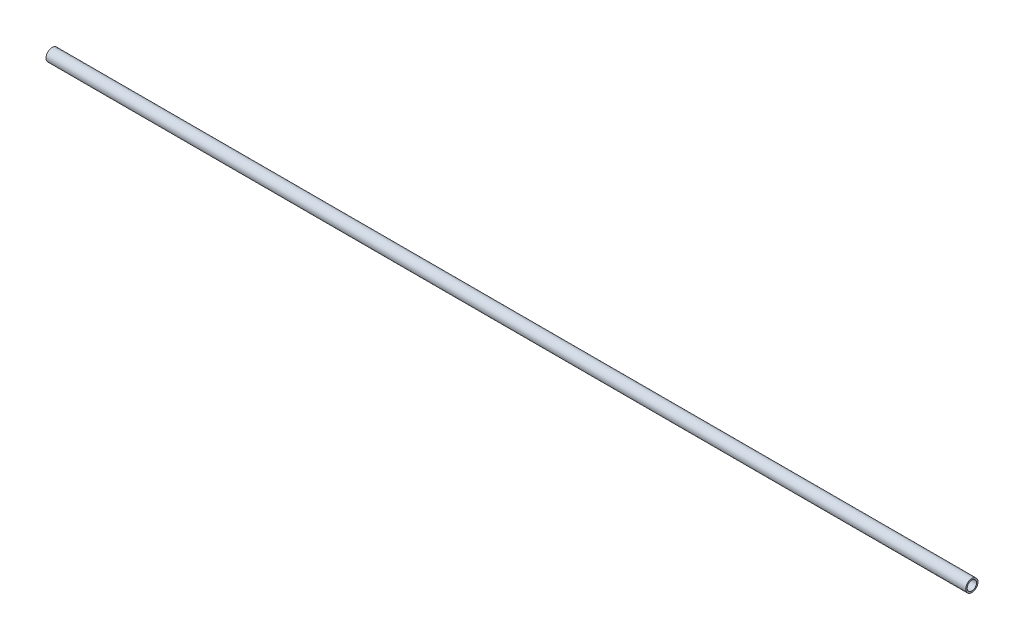
ISO-10303-21;
HEADER;
FILE_DESCRIPTION(('STEP AP214'),'2;1');
FILE_NAME('part.step','',(''),(''),'','','');
FILE_SCHEMA(('AUTOMOTIVE_DESIGN { 1 0 10303 214 1 1 1 1 }'));
ENDSEC;
DATA;
#1=APPLICATION_CONTEXT('core data for automotive mechanical design processes');
#2=APPLICATION_PROTOCOL_DEFINITION('international standard','automotive_design',2000,#1);
#3=PRODUCT_CONTEXT('',#1,'mechanical');
#4=PRODUCT('Part','Part','',(#3));
#5=PRODUCT_RELATED_PRODUCT_CATEGORY('part','',(#4));
#6=PRODUCT_DEFINITION_FORMATION('','',#4);
#7=PRODUCT_DEFINITION_CONTEXT('part definition',#1,'design');
#8=PRODUCT_DEFINITION('design','',#6,#7);
#9=PRODUCT_DEFINITION_SHAPE('','',#8);
#10=(LENGTH_UNIT() NAMED_UNIT(*) SI_UNIT(.MILLI.,.METRE.));
#11=(NAMED_UNIT(*) PLANE_ANGLE_UNIT() SI_UNIT($,.RADIAN.));
#12=(NAMED_UNIT(*) SI_UNIT($,.STERADIAN.) SOLID_ANGLE_UNIT());
#13=UNCERTAINTY_MEASURE_WITH_UNIT(LENGTH_MEASURE(1.E-05),#10,'distance_accuracy_value','');
#14=(GEOMETRIC_REPRESENTATION_CONTEXT(3) GLOBAL_UNCERTAINTY_ASSIGNED_CONTEXT((#13)) GLOBAL_UNIT_ASSIGNED_CONTEXT((#10,
#11,#12)) REPRESENTATION_CONTEXT('',''));
#15=CARTESIAN_POINT('',(0.,0.,0.));
#16=DIRECTION('',(0.,0.,1.));
#17=DIRECTION('',(1.,0.,0.));
#18=AXIS2_PLACEMENT_3D('',#15,#16,#17);
#19=CARTESIAN_POINT('',(1905.,0.,0.));
#20=DIRECTION('',(1.,0.,0.));
#21=DIRECTION('',(0.,0.,-1.));
#22=AXIS2_PLACEMENT_3D('',#19,#20,#21);
#23=PLANE('',#22);
#24=CARTESIAN_POINT('',(1905.,0.,0.));
#25=DIRECTION('',(1.,0.,0.));
#26=DIRECTION('',(0.,0.,-1.));
#27=AXIS2_PLACEMENT_3D('',#24,#25,#26);
#28=CIRCLE('',#27,12.7);
#29=CARTESIAN_POINT('',(1905.,0.,-12.7));
#30=VERTEX_POINT('',#29);
#31=EDGE_CURVE('E10',#30,#30,#28,.T.);
#32=ORIENTED_EDGE('',*,*,#31,.T.);
#33=EDGE_LOOP('',(#32));
#34=FACE_BOUND('',#33,.T.);
#35=CARTESIAN_POINT('',(1905.,0.,0.));
#36=DIRECTION('',(1.,0.,0.));
#37=DIRECTION('',(0.,0.,-1.));
#38=AXIS2_PLACEMENT_3D('',#35,#36,#37);
#39=CIRCLE('',#38,9.652);
#40=CARTESIAN_POINT('',(1905.,0.,-9.652));
#41=VERTEX_POINT('',#40);
#42=EDGE_CURVE('E44',#41,#41,#39,.T.);
#43=ORIENTED_EDGE('',*,*,#42,.F.);
#44=EDGE_LOOP('',(#43));
#45=FACE_BOUND('',#44,.T.);
#46=ADVANCED_FACE('F33',(#34,#45),#23,.T.);
#47=CARTESIAN_POINT('',(0.,0.,0.));
#48=DIRECTION('',(1.,0.,0.));
#49=DIRECTION('',(0.,0.,-1.));
#50=AXIS2_PLACEMENT_3D('',#47,#48,#49);
#51=PLANE('',#50);
#52=CARTESIAN_POINT('',(0.,0.,0.));
#53=DIRECTION('',(1.,0.,0.));
#54=DIRECTION('',(0.,0.,-1.));
#55=AXIS2_PLACEMENT_3D('',#52,#53,#54);
#56=CIRCLE('',#55,12.7);
#57=CARTESIAN_POINT('',(0.,0.,-12.7));
#58=VERTEX_POINT('',#57);
#59=EDGE_CURVE('E37',#58,#58,#56,.T.);
#60=ORIENTED_EDGE('',*,*,#59,.F.);
#61=EDGE_LOOP('',(#60));
#62=FACE_BOUND('',#61,.T.);
#63=CARTESIAN_POINT('',(0.,0.,0.));
#64=DIRECTION('',(1.,0.,0.));
#65=DIRECTION('',(0.,0.,-1.));
#66=AXIS2_PLACEMENT_3D('',#63,#64,#65);
#67=CIRCLE('',#66,9.652);
#68=CARTESIAN_POINT('',(0.,0.,-9.652));
#69=VERTEX_POINT('',#68);
#70=EDGE_CURVE('E46',#69,#69,#67,.T.);
#71=ORIENTED_EDGE('',*,*,#70,.T.);
#72=EDGE_LOOP('',(#71));
#73=FACE_BOUND('',#72,.T.);
#74=ADVANCED_FACE('F56',(#62,#73),#51,.F.);
#75=CARTESIAN_POINT('',(1905.,0.,0.));
#76=DIRECTION('',(-1.,0.,0.));
#77=DIRECTION('',(0.,0.,1.));
#78=AXIS2_PLACEMENT_3D('',#75,#76,#77);
#79=CYLINDRICAL_SURFACE('',#78,12.7);
#80=ORIENTED_EDGE('',*,*,#31,.F.);
#81=EDGE_LOOP('',(#80));
#82=FACE_BOUND('',#81,.T.);
#83=ORIENTED_EDGE('',*,*,#59,.T.);
#84=EDGE_LOOP('',(#83));
#85=FACE_BOUND('',#84,.T.);
#86=ADVANCED_FACE('F35',(#82,#85),#79,.T.);
#87=CARTESIAN_POINT('',(1905.,0.,0.));
#88=DIRECTION('',(-1.,0.,0.));
#89=DIRECTION('',(0.,0.,1.));
#90=AXIS2_PLACEMENT_3D('',#87,#88,#89);
#91=CYLINDRICAL_SURFACE('',#90,9.652);
#92=ORIENTED_EDGE('',*,*,#42,.T.);
#93=EDGE_LOOP('',(#92));
#94=FACE_BOUND('',#93,.T.);
#95=ORIENTED_EDGE('',*,*,#70,.F.);
#96=EDGE_LOOP('',(#95));
#97=FACE_BOUND('',#96,.T.);
#98=ADVANCED_FACE('F52',(#94,#97),#91,.F.);
#99=CLOSED_SHELL('',(#46,#74,#86,#98));
#100=MANIFOLD_SOLID_BREP('B2',#99);
#101=ADVANCED_BREP_SHAPE_REPRESENTATION('',(#18,#100),#14);
#102=SHAPE_DEFINITION_REPRESENTATION(#9,#101);
ENDSEC;
END-ISO-10303-21;
